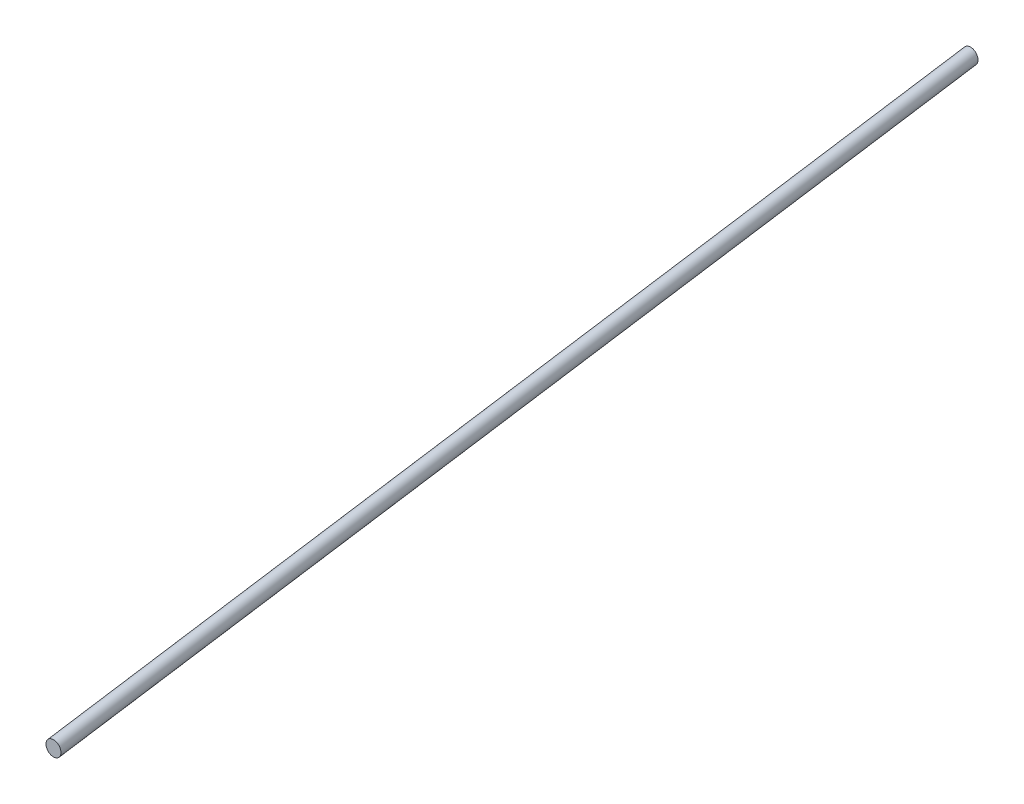
ISO-10303-21;
HEADER;
FILE_DESCRIPTION(('STEP AP214'),'2;1');
FILE_NAME('part.step','',(''),(''),'','','');
FILE_SCHEMA(('AUTOMOTIVE_DESIGN { 1 0 10303 214 1 1 1 1 }'));
ENDSEC;
DATA;
#1=APPLICATION_CONTEXT('core data for automotive mechanical design processes');
#2=APPLICATION_PROTOCOL_DEFINITION('international standard','automotive_design',2000,#1);
#3=PRODUCT_CONTEXT('',#1,'mechanical');
#4=PRODUCT('Part','Part','',(#3));
#5=PRODUCT_RELATED_PRODUCT_CATEGORY('part','',(#4));
#6=PRODUCT_DEFINITION_FORMATION('','',#4);
#7=PRODUCT_DEFINITION_CONTEXT('part definition',#1,'design');
#8=PRODUCT_DEFINITION('design','',#6,#7);
#9=PRODUCT_DEFINITION_SHAPE('','',#8);
#10=(LENGTH_UNIT() NAMED_UNIT(*) SI_UNIT(.MILLI.,.METRE.));
#11=(NAMED_UNIT(*) PLANE_ANGLE_UNIT() SI_UNIT($,.RADIAN.));
#12=(NAMED_UNIT(*) SI_UNIT($,.STERADIAN.) SOLID_ANGLE_UNIT());
#13=UNCERTAINTY_MEASURE_WITH_UNIT(LENGTH_MEASURE(1.E-05),#10,'distance_accuracy_value','');
#14=(GEOMETRIC_REPRESENTATION_CONTEXT(3) GLOBAL_UNCERTAINTY_ASSIGNED_CONTEXT((#13)) GLOBAL_UNIT_ASSIGNED_CONTEXT((#10,
#11,#12)) REPRESENTATION_CONTEXT('',''));
#15=CARTESIAN_POINT('',(0.,0.,0.));
#16=DIRECTION('',(0.,0.,1.));
#17=DIRECTION('',(1.,0.,0.));
#18=AXIS2_PLACEMENT_3D('',#15,#16,#17);
#19=CARTESIAN_POINT('',(19.1,2.1,0.));
#20=DIRECTION('',(0.,0.,1.));
#21=DIRECTION('',(1.,0.,0.));
#22=AXIS2_PLACEMENT_3D('',#19,#20,#21);
#23=PLANE('',#22);
#24=CARTESIAN_POINT('',(19.1,2.1,0.));
#25=DIRECTION('',(0.,0.,1.));
#26=DIRECTION('',(1.,0.,0.));
#27=AXIS2_PLACEMENT_3D('',#24,#25,#26);
#28=CIRCLE('',#27,4.);
#29=CARTESIAN_POINT('',(23.1,2.1,0.));
#30=VERTEX_POINT('',#29);
#31=EDGE_CURVE('E42',#30,#30,#28,.T.);
#32=ORIENTED_EDGE('',*,*,#31,.F.);
#33=EDGE_LOOP('',(#32));
#34=FACE_BOUND('',#33,.T.);
#35=ADVANCED_FACE('F36',(#34),#23,.F.);
#36=CARTESIAN_POINT('',(94.5402780398458,2.1,564.985632073304));
#37=DIRECTION('',(0.,0.,1.));
#38=DIRECTION('',(1.,0.,0.));
#39=AXIS2_PLACEMENT_3D('',#36,#37,#38);
#40=PLANE('',#39);
#41=CARTESIAN_POINT('',(94.5402780398458,2.1,564.985632073304));
#42=DIRECTION('',(0.,0.,1.));
#43=DIRECTION('',(1.,0.,0.));
#44=AXIS2_PLACEMENT_3D('',#41,#42,#43);
#45=CIRCLE('',#44,4.);
#46=CARTESIAN_POINT('',(98.5402780398458,2.1,564.985632073304));
#47=VERTEX_POINT('',#46);
#48=EDGE_CURVE('E10',#47,#47,#45,.T.);
#49=ORIENTED_EDGE('',*,*,#48,.T.);
#50=EDGE_LOOP('',(#49));
#51=FACE_BOUND('',#50,.T.);
#52=ADVANCED_FACE('F51',(#51),#40,.T.);
#53=CARTESIAN_POINT('',(23.1,2.1,0.));
#54=CARTESIAN_POINT('',(98.5402780398458,2.1,564.985632073304));
#55=CARTESIAN_POINT('',(23.1,10.1,0.));
#56=CARTESIAN_POINT('',(98.5402780398458,10.1,564.985632073304));
#57=CARTESIAN_POINT('',(15.1,10.1,0.));
#58=CARTESIAN_POINT('',(90.5402780398458,10.1,564.985632073304));
#59=CARTESIAN_POINT('',(15.1,2.1,0.));
#60=CARTESIAN_POINT('',(90.5402780398458,2.1,564.985632073304));
#61=CARTESIAN_POINT('',(15.1,-5.9,0.));
#62=CARTESIAN_POINT('',(90.5402780398458,-5.9,564.985632073304));
#63=CARTESIAN_POINT('',(23.1,-5.9,0.));
#64=CARTESIAN_POINT('',(98.5402780398458,-5.9,564.985632073304));
#65=CARTESIAN_POINT('',(23.1,2.1,0.));
#66=CARTESIAN_POINT('',(98.5402780398458,2.1,564.985632073304));
#67=(BOUNDED_SURFACE() B_SPLINE_SURFACE(3,1,((#53,#54),(#55,#56),(#57,#58),(#59,#60),(#61,#62),
(#63,#64),(#65,#66)),.UNSPECIFIED.,.T.,.F.,.F.) B_SPLINE_SURFACE_WITH_KNOTS((4,3,4),(2,2),(0.,
0.5,1.),(0.,1.),.UNSPECIFIED.) GEOMETRIC_REPRESENTATION_ITEM() RATIONAL_B_SPLINE_SURFACE(((1.,
1.),(0.333333333333333,0.333333333333333),(0.333333333333333,0.333333333333333),(1.,1.),
(0.333333333333333,0.333333333333333),(0.333333333333333,0.333333333333333),(1.,1.))) REPRESENTATION_ITEM('') SURFACE());
#68=CARTESIAN_POINT('',(98.5402780398458,2.1,564.985632073304));
#69=CARTESIAN_POINT('',(97.7544418102641,2.1,559.10036507254));
#70=CARTESIAN_POINT('',(96.9686055806823,2.1,553.215098071777));
#71=CARTESIAN_POINT('',(95.3969331215189,2.1,541.444564070249));
#72=CARTESIAN_POINT('',(94.6110968919371,2.1,535.559297069486));
#73=CARTESIAN_POINT('',(93.0394244327737,2.1,523.788763067959));
#74=CARTESIAN_POINT('',(92.253588203192,2.1,517.903496067195));
#75=CARTESIAN_POINT('',(90.6819157440285,2.1,506.132962065668));
#76=CARTESIAN_POINT('',(89.8960795144468,2.1,500.247695064905));
#77=CARTESIAN_POINT('',(88.3244070552833,2.1,488.477161063377));
#78=CARTESIAN_POINT('',(87.5385708257016,2.1,482.591894062614));
#79=CARTESIAN_POINT('',(85.9668983665382,2.1,470.821360061087));
#80=CARTESIAN_POINT('',(85.1810621369564,2.1,464.936093060323));
#81=CARTESIAN_POINT('',(83.609389677793,2.1,453.165559058796));
#82=CARTESIAN_POINT('',(82.8235534482113,2.1,447.280292058032));
#83=CARTESIAN_POINT('',(81.2518809890478,2.1,435.509758056505));
#84=CARTESIAN_POINT('',(80.4660447594661,2.1,429.624491055741));
#85=CARTESIAN_POINT('',(78.8943723003026,2.1,417.853957054214));
#86=CARTESIAN_POINT('',(78.1085360707209,2.1,411.968690053451));
#87=CARTESIAN_POINT('',(76.5368636115574,2.1,400.198156051924));
#88=CARTESIAN_POINT('',(75.7510273819757,2.1,394.31288905116));
#89=CARTESIAN_POINT('',(74.1793549228123,2.1,382.542355049633));
#90=CARTESIAN_POINT('',(73.3935186932305,2.1,376.657088048869));
#91=CARTESIAN_POINT('',(71.8218462340671,2.1,364.886554047342));
#92=CARTESIAN_POINT('',(71.0360100044853,2.1,359.001287046579));
#93=CARTESIAN_POINT('',(69.4643375453219,2.1,347.230753045051));
#94=CARTESIAN_POINT('',(68.6785013157402,2.1,341.345486044288));
#95=CARTESIAN_POINT('',(67.1068288565767,2.1,329.574952042761));
#96=CARTESIAN_POINT('',(66.320992626995,2.1,323.689685041997));
#97=CARTESIAN_POINT('',(64.7493201678315,2.1,311.91915104047));
#98=CARTESIAN_POINT('',(63.9634839382498,2.1,306.033884039706));
#99=CARTESIAN_POINT('',(62.3918114790863,2.1,294.263350038179));
#100=CARTESIAN_POINT('',(61.6059752495046,2.1,288.378083037416));
#101=CARTESIAN_POINT('',(60.0343027903412,2.1,276.607549035888));
#102=CARTESIAN_POINT('',(59.2484665607594,2.1,270.722282035125));
#103=CARTESIAN_POINT('',(57.676794101596,2.1,258.951748033598));
#104=CARTESIAN_POINT('',(56.8909578720143,2.1,253.066481032834));
#105=CARTESIAN_POINT('',(55.3192854128508,2.1,241.295947031307));
#106=CARTESIAN_POINT('',(54.5334491832691,2.1,235.410680030543));
#107=CARTESIAN_POINT('',(52.9617767241056,2.1,223.640146029016));
#108=CARTESIAN_POINT('',(52.1759404945239,2.1,217.754879028253));
#109=CARTESIAN_POINT('',(50.6042680353604,2.1,205.984345026725));
#110=CARTESIAN_POINT('',(49.8184318057787,2.1,200.099078025962));
#111=CARTESIAN_POINT('',(48.2467593466153,2.1,188.328544024435));
#112=CARTESIAN_POINT('',(47.4609231170335,2.1,182.443277023671));
#113=CARTESIAN_POINT('',(45.8892506578701,2.1,170.672743022144));
#114=CARTESIAN_POINT('',(45.1034144282884,2.1,164.78747602138));
#115=CARTESIAN_POINT('',(43.5317419691249,2.1,153.016942019853));
#116=CARTESIAN_POINT('',(42.7459057395432,2.1,147.13167501909));
#117=CARTESIAN_POINT('',(41.1742332803797,2.1,135.361141017562));
#118=CARTESIAN_POINT('',(40.388397050798,2.1,129.475874016799));
#119=CARTESIAN_POINT('',(38.8167245916345,2.1,117.705340015272));
#120=CARTESIAN_POINT('',(38.0308883620528,2.1,111.820073014508));
#121=CARTESIAN_POINT('',(36.4592159028894,2.1,100.049539012981));
#122=CARTESIAN_POINT('',(35.6733796733076,2.1,94.1642720122173));
#123=CARTESIAN_POINT('',(34.1017072141442,2.1,82.3937380106902));
#124=CARTESIAN_POINT('',(33.3158709845625,2.1,76.5084710099266));
#125=CARTESIAN_POINT('',(31.744198525399,2.1,64.7379370083994));
#126=CARTESIAN_POINT('',(30.9583622958173,2.1,58.8526700076358));
#127=CARTESIAN_POINT('',(29.3866898366538,2.1,47.0821360061087));
#128=CARTESIAN_POINT('',(28.6008536070721,2.1,41.1968690053451));
#129=CARTESIAN_POINT('',(27.0291811479086,2.1,29.4263350038179));
#130=CARTESIAN_POINT('',(26.2433449183269,2.1,23.5410680030543));
#131=CARTESIAN_POINT('',(24.6716724591635,2.1,11.7705340015272));
#132=CARTESIAN_POINT('',(23.8858362295817,2.1,5.88526700076359));
#133=CARTESIAN_POINT('',(23.1,2.1,0.));
#134=B_SPLINE_CURVE_WITH_KNOTS('',3,(#68,#69,#70,#71,#72,#73,#74,#75,#76,#77,#78,#79,#80,#81,
#82,#83,#84,#85,#86,#87,#88,#89,#90,#91,#92,#93,#94,#95,#96,#97,#98,#99,#100,#101,#102,#103,
#104,#105,#106,#107,#108,#109,#110,#111,#112,#113,#114,#115,#116,#117,#118,#119,#120,#121,#122,
#123,#124,#125,#126,#127,#128,#129,#130,#131,#132,#133),.UNSPECIFIED.,.F.,.F.,(4,2,2,2,2,2,2,2,
2,2,2,2,2,2,2,2,2,2,2,2,2,2,2,2,2,2,2,2,2,2,2,2,4),(0.,17.8124999999999,35.625,53.4374999999999,
71.25,89.0625,106.875,124.6875,142.5,160.3125,178.125,195.9375,213.75,231.5625,249.375,267.1875,
285.,302.8125,320.625,338.4375,356.25,374.0625,391.875,409.6875,427.5,445.3125,463.125,480.9375,
498.75,516.5625,534.375,552.1875,570.),.UNSPECIFIED.);
#135=EDGE_CURVE('BSEAM48',#47,#30,#134,.T.);
#136=ORIENTED_EDGE('',*,*,#48,.F.);
#137=ORIENTED_EDGE('',*,*,#31,.T.);
#138=ORIENTED_EDGE('',*,*,#135,.T.);
#139=ORIENTED_EDGE('',*,*,#135,.F.);
#140=EDGE_LOOP('',(#136,#138,#137,#139));
#141=FACE_BOUND('',#140,.T.);
#142=ADVANCED_FACE('F48',(#141),#67,.T.);
#143=CLOSED_SHELL('',(#35,#52,#142));
#144=MANIFOLD_SOLID_BREP('B2',#143);
#145=ADVANCED_BREP_SHAPE_REPRESENTATION('',(#18,#144),#14);
#146=SHAPE_DEFINITION_REPRESENTATION(#9,#145);
ENDSEC;
END-ISO-10303-21;
